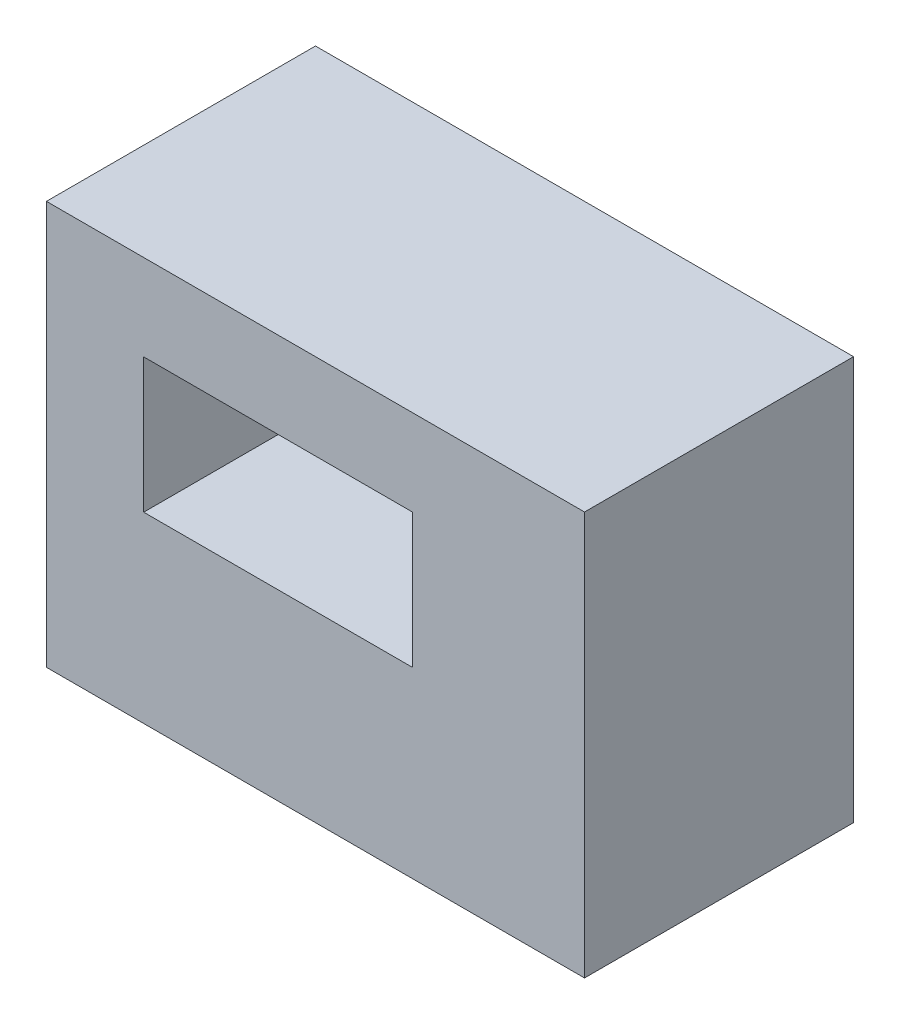
ISO-10303-21;
HEADER;
FILE_DESCRIPTION(('STEP AP214'),'2;1');
FILE_NAME('part.step','',(''),(''),'','','');
FILE_SCHEMA(('AUTOMOTIVE_DESIGN { 1 0 10303 214 1 1 1 1 }'));
ENDSEC;
DATA;
#1=APPLICATION_CONTEXT('core data for automotive mechanical design processes');
#2=APPLICATION_PROTOCOL_DEFINITION('international standard','automotive_design',2000,#1);
#3=PRODUCT_CONTEXT('',#1,'mechanical');
#4=PRODUCT('Part','Part','',(#3));
#5=PRODUCT_RELATED_PRODUCT_CATEGORY('part','',(#4));
#6=PRODUCT_DEFINITION_FORMATION('','',#4);
#7=PRODUCT_DEFINITION_CONTEXT('part definition',#1,'design');
#8=PRODUCT_DEFINITION('design','',#6,#7);
#9=PRODUCT_DEFINITION_SHAPE('','',#8);
#10=(LENGTH_UNIT() NAMED_UNIT(*) SI_UNIT(.MILLI.,.METRE.));
#11=(NAMED_UNIT(*) PLANE_ANGLE_UNIT() SI_UNIT($,.RADIAN.));
#12=(NAMED_UNIT(*) SI_UNIT($,.STERADIAN.) SOLID_ANGLE_UNIT());
#13=UNCERTAINTY_MEASURE_WITH_UNIT(LENGTH_MEASURE(1.E-05),#10,'distance_accuracy_value','');
#14=(GEOMETRIC_REPRESENTATION_CONTEXT(3) GLOBAL_UNCERTAINTY_ASSIGNED_CONTEXT((#13)) GLOBAL_UNIT_ASSIGNED_CONTEXT((#10,
#11,#12)) REPRESENTATION_CONTEXT('',''));
#15=CARTESIAN_POINT('',(0.,0.,0.));
#16=DIRECTION('',(0.,0.,1.));
#17=DIRECTION('',(1.,0.,0.));
#18=AXIS2_PLACEMENT_3D('',#15,#16,#17);
#19=CARTESIAN_POINT('',(-68.5695473251029,39.9292181069959,50.8));
#20=DIRECTION('',(1.,0.,0.));
#21=DIRECTION('',(0.,0.,-1.));
#22=AXIS2_PLACEMENT_3D('',#19,#20,#21);
#23=PLANE('',#22);
#24=DIRECTION('',(0.,-1.,0.));
#25=VECTOR('',#24,1.);
#26=CARTESIAN_POINT('',(-68.5695473251029,39.9292181069959,0.));
#27=LINE('',#26,#25);
#28=CARTESIAN_POINT('',(-68.5695473251029,39.9292181069959,0.));
#29=VERTEX_POINT('',#28);
#30=CARTESIAN_POINT('',(-68.5695473251029,-36.2707818930041,0.));
#31=VERTEX_POINT('',#30);
#32=EDGE_CURVE('E145',#29,#31,#27,.T.);
#33=ORIENTED_EDGE('',*,*,#32,.T.);
#34=DIRECTION('',(0.,0.,-1.));
#35=VECTOR('',#34,1.);
#36=CARTESIAN_POINT('',(-68.5695473251029,-36.2707818930041,50.8));
#37=LINE('',#36,#35);
#38=CARTESIAN_POINT('',(-68.5695473251029,-36.2707818930041,50.8));
#39=VERTEX_POINT('',#38);
#40=EDGE_CURVE('E11',#39,#31,#37,.T.);
#41=ORIENTED_EDGE('',*,*,#40,.F.);
#42=DIRECTION('',(0.,-1.,0.));
#43=VECTOR('',#42,1.);
#44=CARTESIAN_POINT('',(-68.5695473251029,39.9292181069959,50.8));
#45=LINE('',#44,#43);
#46=CARTESIAN_POINT('',(-68.5695473251029,39.9292181069959,50.8));
#47=VERTEX_POINT('',#46);
#48=EDGE_CURVE('E149',#47,#39,#45,.T.);
#49=ORIENTED_EDGE('',*,*,#48,.F.);
#50=DIRECTION('',(0.,0.,-1.));
#51=VECTOR('',#50,1.);
#52=CARTESIAN_POINT('',(-68.5695473251029,39.9292181069959,50.8));
#53=LINE('',#52,#51);
#54=EDGE_CURVE('E155',#47,#29,#53,.T.);
#55=ORIENTED_EDGE('',*,*,#54,.T.);
#56=EDGE_LOOP('',(#33,#41,#49,#55));
#57=FACE_BOUND('',#56,.T.);
#58=ADVANCED_FACE('F37',(#57),#23,.F.);
#59=CARTESIAN_POINT('',(-68.5695473251029,-36.2707818930041,50.8));
#60=DIRECTION('',(0.,1.,0.));
#61=DIRECTION('',(0.,0.,1.));
#62=AXIS2_PLACEMENT_3D('',#59,#60,#61);
#63=PLANE('',#62);
#64=DIRECTION('',(1.,0.,0.));
#65=VECTOR('',#64,1.);
#66=CARTESIAN_POINT('',(-68.5695473251029,-36.2707818930041,0.));
#67=LINE('',#66,#65);
#68=CARTESIAN_POINT('',(33.0304526748971,-36.2707818930041,0.));
#69=VERTEX_POINT('',#68);
#70=EDGE_CURVE('E158',#31,#69,#67,.T.);
#71=ORIENTED_EDGE('',*,*,#70,.T.);
#72=DIRECTION('',(0.,0.,-1.));
#73=VECTOR('',#72,1.);
#74=CARTESIAN_POINT('',(33.0304526748971,-36.2707818930041,50.8));
#75=LINE('',#74,#73);
#76=CARTESIAN_POINT('',(33.0304526748971,-36.2707818930041,50.8));
#77=VERTEX_POINT('',#76);
#78=EDGE_CURVE('E44',#77,#69,#75,.T.);
#79=ORIENTED_EDGE('',*,*,#78,.F.);
#80=DIRECTION('',(1.,0.,0.));
#81=VECTOR('',#80,1.);
#82=CARTESIAN_POINT('',(-68.5695473251029,-36.2707818930041,50.8));
#83=LINE('',#82,#81);
#84=EDGE_CURVE('E88',#39,#77,#83,.T.);
#85=ORIENTED_EDGE('',*,*,#84,.F.);
#86=ORIENTED_EDGE('',*,*,#40,.T.);
#87=EDGE_LOOP('',(#71,#79,#85,#86));
#88=FACE_BOUND('',#87,.T.);
#89=ADVANCED_FACE('F187',(#88),#63,.F.);
#90=CARTESIAN_POINT('',(33.0304526748971,39.9292181069959,50.8));
#91=DIRECTION('',(-1.,0.,0.));
#92=DIRECTION('',(0.,0.,1.));
#93=AXIS2_PLACEMENT_3D('',#90,#91,#92);
#94=PLANE('',#93);
#95=DIRECTION('',(0.,1.,0.));
#96=VECTOR('',#95,1.);
#97=CARTESIAN_POINT('',(33.0304526748971,39.9292181069959,0.));
#98=LINE('',#97,#96);
#99=CARTESIAN_POINT('',(33.0304526748971,39.9292181069959,0.));
#100=VERTEX_POINT('',#99);
#101=EDGE_CURVE('E160',#69,#100,#98,.T.);
#102=ORIENTED_EDGE('',*,*,#101,.T.);
#103=DIRECTION('',(0.,0.,-1.));
#104=VECTOR('',#103,1.);
#105=CARTESIAN_POINT('',(33.0304526748971,39.9292181069959,50.8));
#106=LINE('',#105,#104);
#107=CARTESIAN_POINT('',(33.0304526748971,39.9292181069959,50.8));
#108=VERTEX_POINT('',#107);
#109=EDGE_CURVE('E164',#108,#100,#106,.T.);
#110=ORIENTED_EDGE('',*,*,#109,.F.);
#111=DIRECTION('',(0.,1.,0.));
#112=VECTOR('',#111,1.);
#113=CARTESIAN_POINT('',(33.0304526748971,39.9292181069959,50.8));
#114=LINE('',#113,#112);
#115=EDGE_CURVE('E152',#77,#108,#114,.T.);
#116=ORIENTED_EDGE('',*,*,#115,.F.);
#117=ORIENTED_EDGE('',*,*,#78,.T.);
#118=EDGE_LOOP('',(#102,#110,#116,#117));
#119=FACE_BOUND('',#118,.T.);
#120=ADVANCED_FACE('F169',(#119),#94,.F.);
#121=CARTESIAN_POINT('',(-68.5695473251029,39.9292181069959,50.8));
#122=DIRECTION('',(0.,-1.,0.));
#123=DIRECTION('',(1.,0.,0.));
#124=AXIS2_PLACEMENT_3D('',#121,#122,#123);
#125=PLANE('',#124);
#126=DIRECTION('',(-1.,0.,0.));
#127=VECTOR('',#126,1.);
#128=CARTESIAN_POINT('',(-68.5695473251029,39.9292181069959,0.));
#129=LINE('',#128,#127);
#130=EDGE_CURVE('E81',#100,#29,#129,.T.);
#131=ORIENTED_EDGE('',*,*,#130,.T.);
#132=ORIENTED_EDGE('',*,*,#54,.F.);
#133=DIRECTION('',(-1.,0.,0.));
#134=VECTOR('',#133,1.);
#135=CARTESIAN_POINT('',(-68.5695473251029,39.9292181069959,50.8));
#136=LINE('',#135,#134);
#137=EDGE_CURVE('E60',#108,#47,#136,.T.);
#138=ORIENTED_EDGE('',*,*,#137,.F.);
#139=ORIENTED_EDGE('',*,*,#109,.T.);
#140=EDGE_LOOP('',(#131,#132,#138,#139));
#141=FACE_BOUND('',#140,.T.);
#142=ADVANCED_FACE('F177',(#141),#125,.F.);
#143=CARTESIAN_POINT('',(0.,0.,50.8));
#144=DIRECTION('',(0.,0.,1.));
#145=DIRECTION('',(1.,0.,0.));
#146=AXIS2_PLACEMENT_3D('',#143,#144,#145);
#147=PLANE('',#146);
#148=DIRECTION('',(0.,-1.,0.));
#149=VECTOR('',#148,1.);
#150=CARTESIAN_POINT('',(-50.2060575978862,23.6799214557798,50.8));
#151=LINE('',#150,#149);
#152=CARTESIAN_POINT('',(-50.2060575978862,23.6799214557798,50.8));
#153=VERTEX_POINT('',#152);
#154=CARTESIAN_POINT('',(-50.2060575978862,-1.72007854422015,50.8));
#155=VERTEX_POINT('',#154);
#156=EDGE_CURVE('E51',#153,#155,#151,.T.);
#157=ORIENTED_EDGE('',*,*,#156,.F.);
#158=DIRECTION('',(-1.,0.,0.));
#159=VECTOR('',#158,1.);
#160=CARTESIAN_POINT('',(-50.2060575978862,23.6799214557798,50.8));
#161=LINE('',#160,#159);
#162=CARTESIAN_POINT('',(0.593942402113842,23.6799214557798,50.8));
#163=VERTEX_POINT('',#162);
#164=EDGE_CURVE('E130',#163,#153,#161,.T.);
#165=ORIENTED_EDGE('',*,*,#164,.F.);
#166=DIRECTION('',(0.,1.,0.));
#167=VECTOR('',#166,1.);
#168=CARTESIAN_POINT('',(0.593942402113842,23.6799214557798,50.8));
#169=LINE('',#168,#167);
#170=CARTESIAN_POINT('',(0.593942402113845,-1.72007854422015,50.8));
#171=VERTEX_POINT('',#170);
#172=EDGE_CURVE('E133',#171,#163,#169,.T.);
#173=ORIENTED_EDGE('',*,*,#172,.F.);
#174=DIRECTION('',(1.,0.,0.));
#175=VECTOR('',#174,1.);
#176=CARTESIAN_POINT('',(-50.2060575978862,-1.72007854422015,50.8));
#177=LINE('',#176,#175);
#178=EDGE_CURVE('E139',#155,#171,#177,.T.);
#179=ORIENTED_EDGE('',*,*,#178,.F.);
#180=EDGE_LOOP('',(#157,#165,#173,#179));
#181=FACE_BOUND('',#180,.T.);
#182=ORIENTED_EDGE('',*,*,#48,.T.);
#183=ORIENTED_EDGE('',*,*,#84,.T.);
#184=ORIENTED_EDGE('',*,*,#115,.T.);
#185=ORIENTED_EDGE('',*,*,#137,.T.);
#186=EDGE_LOOP('',(#182,#183,#184,#185));
#187=FACE_BOUND('',#186,.T.);
#188=ADVANCED_FACE('F179',(#181,#187),#147,.T.);
#189=CARTESIAN_POINT('',(0.,0.,0.));
#190=DIRECTION('',(0.,0.,1.));
#191=DIRECTION('',(1.,0.,0.));
#192=AXIS2_PLACEMENT_3D('',#189,#190,#191);
#193=PLANE('',#192);
#194=ORIENTED_EDGE('',*,*,#32,.F.);
#195=ORIENTED_EDGE('',*,*,#130,.F.);
#196=ORIENTED_EDGE('',*,*,#101,.F.);
#197=ORIENTED_EDGE('',*,*,#70,.F.);
#198=EDGE_LOOP('',(#194,#195,#196,#197));
#199=FACE_BOUND('',#198,.T.);
#200=ADVANCED_FACE('F173',(#199),#193,.F.);
#201=CARTESIAN_POINT('',(-50.2060575978862,23.6799214557798,25.4));
#202=DIRECTION('',(-1.,0.,0.));
#203=DIRECTION('',(0.,0.,1.));
#204=AXIS2_PLACEMENT_3D('',#201,#202,#203);
#205=PLANE('',#204);
#206=ORIENTED_EDGE('',*,*,#156,.T.);
#207=DIRECTION('',(0.,0.,1.));
#208=VECTOR('',#207,1.);
#209=CARTESIAN_POINT('',(-50.2060575978862,-1.72007854422015,25.4));
#210=LINE('',#209,#208);
#211=CARTESIAN_POINT('',(-50.2060575978862,-1.72007854422015,25.4));
#212=VERTEX_POINT('',#211);
#213=EDGE_CURVE('E108',#212,#155,#210,.T.);
#214=ORIENTED_EDGE('',*,*,#213,.F.);
#215=DIRECTION('',(0.,-1.,0.));
#216=VECTOR('',#215,1.);
#217=CARTESIAN_POINT('',(-50.2060575978862,23.6799214557798,25.4));
#218=LINE('',#217,#216);
#219=CARTESIAN_POINT('',(-50.2060575978862,23.6799214557798,25.4));
#220=VERTEX_POINT('',#219);
#221=EDGE_CURVE('E112',#220,#212,#218,.T.);
#222=ORIENTED_EDGE('',*,*,#221,.F.);
#223=DIRECTION('',(0.,0.,1.));
#224=VECTOR('',#223,1.);
#225=CARTESIAN_POINT('',(-50.2060575978862,23.6799214557798,25.4));
#226=LINE('',#225,#224);
#227=EDGE_CURVE('E143',#220,#153,#226,.T.);
#228=ORIENTED_EDGE('',*,*,#227,.T.);
#229=EDGE_LOOP('',(#206,#214,#222,#228));
#230=FACE_BOUND('',#229,.T.);
#231=ADVANCED_FACE('F110',(#230),#205,.F.);
#232=CARTESIAN_POINT('',(-50.2060575978862,23.6799214557798,25.4));
#233=DIRECTION('',(0.,1.,0.));
#234=DIRECTION('',(0.,0.,1.));
#235=AXIS2_PLACEMENT_3D('',#232,#233,#234);
#236=PLANE('',#235);
#237=ORIENTED_EDGE('',*,*,#164,.T.);
#238=ORIENTED_EDGE('',*,*,#227,.F.);
#239=DIRECTION('',(-1.,0.,0.));
#240=VECTOR('',#239,1.);
#241=CARTESIAN_POINT('',(-50.2060575978862,23.6799214557798,25.4));
#242=LINE('',#241,#240);
#243=CARTESIAN_POINT('',(0.593942402113842,23.6799214557798,25.4));
#244=VERTEX_POINT('',#243);
#245=EDGE_CURVE('E118',#244,#220,#242,.T.);
#246=ORIENTED_EDGE('',*,*,#245,.F.);
#247=DIRECTION('',(0.,0.,1.));
#248=VECTOR('',#247,1.);
#249=CARTESIAN_POINT('',(0.593942402113842,23.6799214557798,25.4));
#250=LINE('',#249,#248);
#251=EDGE_CURVE('E146',#244,#163,#250,.T.);
#252=ORIENTED_EDGE('',*,*,#251,.T.);
#253=EDGE_LOOP('',(#237,#238,#246,#252));
#254=FACE_BOUND('',#253,.T.);
#255=ADVANCED_FACE('F230',(#254),#236,.F.);
#256=CARTESIAN_POINT('',(0.593942402113842,23.6799214557798,25.4));
#257=DIRECTION('',(1.,0.,0.));
#258=DIRECTION('',(0.,1.,0.));
#259=AXIS2_PLACEMENT_3D('',#256,#257,#258);
#260=PLANE('',#259);
#261=ORIENTED_EDGE('',*,*,#172,.T.);
#262=ORIENTED_EDGE('',*,*,#251,.F.);
#263=DIRECTION('',(0.,1.,0.));
#264=VECTOR('',#263,1.);
#265=CARTESIAN_POINT('',(0.593942402113842,23.6799214557798,25.4));
#266=LINE('',#265,#264);
#267=CARTESIAN_POINT('',(0.593942402113845,-1.72007854422015,25.4));
#268=VERTEX_POINT('',#267);
#269=EDGE_CURVE('E126',#268,#244,#266,.T.);
#270=ORIENTED_EDGE('',*,*,#269,.F.);
#271=DIRECTION('',(0.,0.,1.));
#272=VECTOR('',#271,1.);
#273=CARTESIAN_POINT('',(0.593942402113845,-1.72007854422015,25.4));
#274=LINE('',#273,#272);
#275=EDGE_CURVE('E117',#268,#171,#274,.T.);
#276=ORIENTED_EDGE('',*,*,#275,.T.);
#277=EDGE_LOOP('',(#261,#262,#270,#276));
#278=FACE_BOUND('',#277,.T.);
#279=ADVANCED_FACE('F240',(#278),#260,.F.);
#280=CARTESIAN_POINT('',(-50.2060575978862,-1.72007854422015,25.4));
#281=DIRECTION('',(0.,-1.,0.));
#282=DIRECTION('',(0.,0.,-1.));
#283=AXIS2_PLACEMENT_3D('',#280,#281,#282);
#284=PLANE('',#283);
#285=ORIENTED_EDGE('',*,*,#178,.T.);
#286=ORIENTED_EDGE('',*,*,#275,.F.);
#287=DIRECTION('',(1.,0.,0.));
#288=VECTOR('',#287,1.);
#289=CARTESIAN_POINT('',(-50.2060575978862,-1.72007854422015,25.4));
#290=LINE('',#289,#288);
#291=EDGE_CURVE('E121',#212,#268,#290,.T.);
#292=ORIENTED_EDGE('',*,*,#291,.F.);
#293=ORIENTED_EDGE('',*,*,#213,.T.);
#294=EDGE_LOOP('',(#285,#286,#292,#293));
#295=FACE_BOUND('',#294,.T.);
#296=ADVANCED_FACE('F122',(#295),#284,.F.);
#297=CARTESIAN_POINT('',(0.,0.,25.4));
#298=DIRECTION('',(0.,0.,1.));
#299=DIRECTION('',(1.,0.,0.));
#300=AXIS2_PLACEMENT_3D('',#297,#298,#299);
#301=PLANE('',#300);
#302=ORIENTED_EDGE('',*,*,#221,.T.);
#303=ORIENTED_EDGE('',*,*,#291,.T.);
#304=ORIENTED_EDGE('',*,*,#269,.T.);
#305=ORIENTED_EDGE('',*,*,#245,.T.);
#306=EDGE_LOOP('',(#302,#303,#304,#305));
#307=FACE_BOUND('',#306,.T.);
#308=ADVANCED_FACE('F128',(#307),#301,.T.);
#309=CLOSED_SHELL('',(#58,#89,#120,#142,#188,#200,#231,#255,#279,#296,#308));
#310=MANIFOLD_SOLID_BREP('B2',#309);
#311=ADVANCED_BREP_SHAPE_REPRESENTATION('',(#18,#310),#14);
#312=SHAPE_DEFINITION_REPRESENTATION(#9,#311);
ENDSEC;
END-ISO-10303-21;
